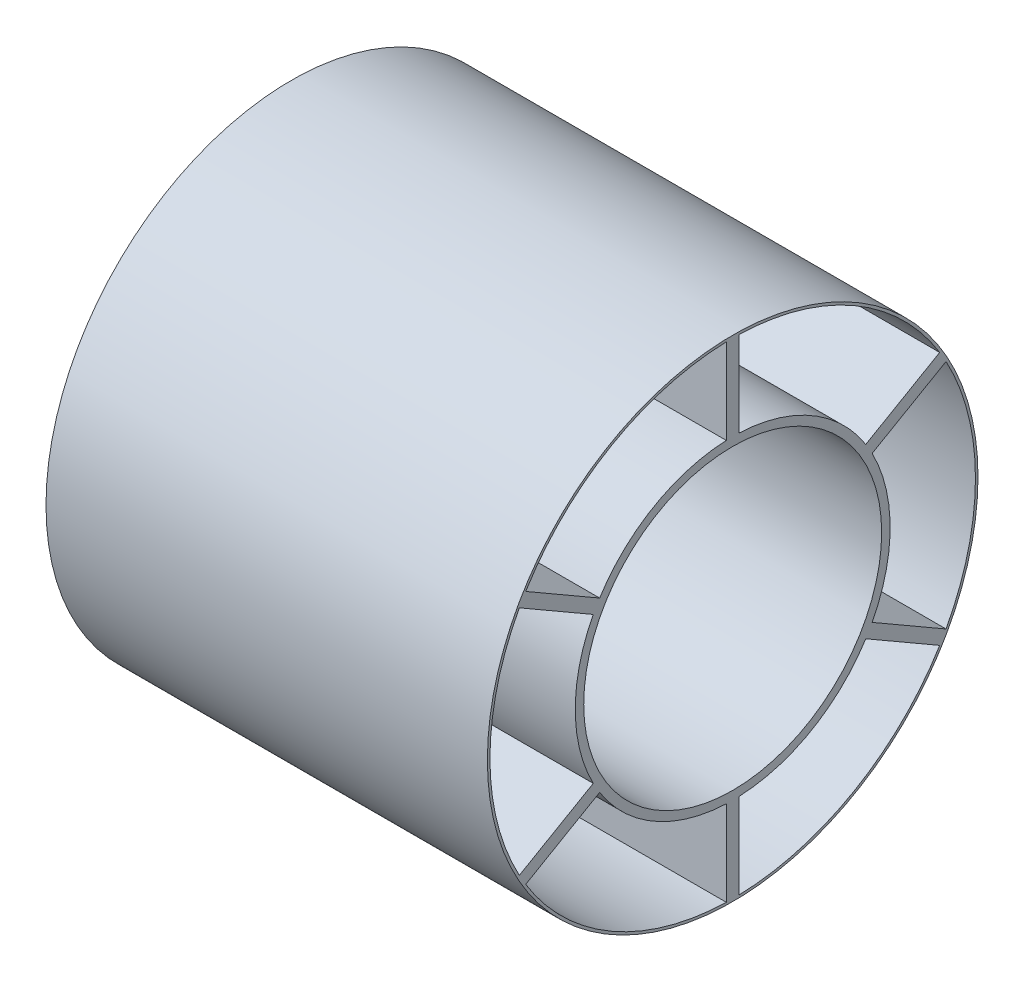
ISO-10303-21;
HEADER;
FILE_DESCRIPTION(('STEP AP214'),'2;1');
FILE_NAME('part.step','',(''),(''),'','','');
FILE_SCHEMA(('AUTOMOTIVE_DESIGN { 1 0 10303 214 1 1 1 1 }'));
ENDSEC;
DATA;
#1=APPLICATION_CONTEXT('core data for automotive mechanical design processes');
#2=APPLICATION_PROTOCOL_DEFINITION('international standard','automotive_design',2000,#1);
#3=PRODUCT_CONTEXT('',#1,'mechanical');
#4=PRODUCT('Part','Part','',(#3));
#5=PRODUCT_RELATED_PRODUCT_CATEGORY('part','',(#4));
#6=PRODUCT_DEFINITION_FORMATION('','',#4);
#7=PRODUCT_DEFINITION_CONTEXT('part definition',#1,'design');
#8=PRODUCT_DEFINITION('design','',#6,#7);
#9=PRODUCT_DEFINITION_SHAPE('','',#8);
#10=(LENGTH_UNIT() NAMED_UNIT(*) SI_UNIT(.MILLI.,.METRE.));
#11=(NAMED_UNIT(*) PLANE_ANGLE_UNIT() SI_UNIT($,.RADIAN.));
#12=(NAMED_UNIT(*) SI_UNIT($,.STERADIAN.) SOLID_ANGLE_UNIT());
#13=UNCERTAINTY_MEASURE_WITH_UNIT(LENGTH_MEASURE(1.E-05),#10,'distance_accuracy_value','');
#14=(GEOMETRIC_REPRESENTATION_CONTEXT(3) GLOBAL_UNCERTAINTY_ASSIGNED_CONTEXT((#13)) GLOBAL_UNIT_ASSIGNED_CONTEXT((#10,
#11,#12)) REPRESENTATION_CONTEXT('',''));
#15=CARTESIAN_POINT('',(0.,0.,0.));
#16=DIRECTION('',(0.,0.,1.));
#17=DIRECTION('',(1.,0.,0.));
#18=AXIS2_PLACEMENT_3D('',#15,#16,#17);
#19=CARTESIAN_POINT('',(52.,0.,0.));
#20=DIRECTION('',(1.,0.,0.));
#21=DIRECTION('',(0.,0.,-1.));
#22=AXIS2_PLACEMENT_3D('',#19,#20,#21);
#23=PLANE('',#22);
#24=CARTESIAN_POINT('',(52.,0.,0.));
#25=DIRECTION('',(1.,0.,0.));
#26=DIRECTION('',(0.,0.,-1.));
#27=AXIS2_PLACEMENT_3D('',#24,#25,#26);
#28=CIRCLE('',#27,28.6);
#29=CARTESIAN_POINT('',(52.,13.6455631434975,25.1348086624271));
#30=VERTEX_POINT('',#29);
#31=CARTESIAN_POINT('',(52.,-13.6455631434992,25.1348086624262));
#32=VERTEX_POINT('',#31);
#33=EDGE_CURVE('E415',#30,#32,#28,.T.);
#34=ORIENTED_EDGE('',*,*,#33,.F.);
#35=DIRECTION('',(0.,0.499999999999999,0.866025403784439));
#36=VECTOR('',#35,1.);
#37=CARTESIAN_POINT('',(52.,8.61789698400815,16.4266354306968));
#38=LINE('',#37,#36);
#39=CARTESIAN_POINT('',(52.,8.61789698400815,16.4266354306968));
#40=VERTEX_POINT('',#39);
#41=EDGE_CURVE('E218',#40,#30,#38,.T.);
#42=ORIENTED_EDGE('',*,*,#41,.F.);
#43=CARTESIAN_POINT('',(52.,0.,0.));
#44=DIRECTION('',(1.,0.,0.));
#45=DIRECTION('',(0.,0.,-1.));
#46=AXIS2_PLACEMENT_3D('',#43,#44,#45);
#47=CIRCLE('',#46,18.55);
#48=CARTESIAN_POINT('',(52.,-8.61789698400827,16.4266354306967));
#49=VERTEX_POINT('',#48);
#50=EDGE_CURVE('E242',#49,#40,#47,.F.);
#51=ORIENTED_EDGE('',*,*,#50,.F.);
#52=DIRECTION('',(0.,0.500000000000152,-0.866025403784351));
#53=VECTOR('',#52,1.);
#54=CARTESIAN_POINT('',(52.,-8.61789698400827,16.4266354306967));
#55=LINE('',#54,#53);
#56=EDGE_CURVE('E246',#32,#49,#55,.T.);
#57=ORIENTED_EDGE('',*,*,#56,.F.);
#58=EDGE_LOOP('',(#34,#42,#51,#57));
#59=FACE_BOUND('',#58,.T.);
#60=CARTESIAN_POINT('',(52.,-14.9446012491744,24.384808662427));
#61=VERTEX_POINT('',#60);
#62=CARTESIAN_POINT('',(52.,-28.5901643926718,0.7499999999998));
#63=VERTEX_POINT('',#62);
#64=EDGE_CURVE('E416',#61,#63,#28,.T.);
#65=ORIENTED_EDGE('',*,*,#64,.F.);
#66=DIRECTION('',(0.,-0.500000000000004,0.866025403784436));
#67=VECTOR('',#66,1.);
#68=CARTESIAN_POINT('',(52.,-9.91693508968492,15.6766354306967));
#69=LINE('',#68,#67);
#70=CARTESIAN_POINT('',(52.,-9.91693508968493,15.6766354306967));
#71=VERTEX_POINT('',#70);
#72=EDGE_CURVE('E249',#71,#61,#69,.T.);
#73=ORIENTED_EDGE('',*,*,#72,.F.);
#74=CARTESIAN_POINT('',(52.,0.,0.));
#75=DIRECTION('',(1.,0.,0.));
#76=DIRECTION('',(0.,0.,-1.));
#77=AXIS2_PLACEMENT_3D('',#74,#75,#76);
#78=CIRCLE('',#77,18.55);
#79=CARTESIAN_POINT('',(52.,-18.534832073693,0.749999999999871));
#80=VERTEX_POINT('',#79);
#81=EDGE_CURVE('E252',#80,#71,#78,.F.);
#82=ORIENTED_EDGE('',*,*,#81,.F.);
#83=DIRECTION('',(0.,1.,0.));
#84=VECTOR('',#83,1.);
#85=CARTESIAN_POINT('',(52.,-18.534832073693,0.749999999999871));
#86=LINE('',#85,#84);
#87=EDGE_CURVE('E256',#63,#80,#86,.T.);
#88=ORIENTED_EDGE('',*,*,#87,.F.);
#89=EDGE_LOOP('',(#65,#73,#82,#88));
#90=FACE_BOUND('',#89,.T.);
#91=CARTESIAN_POINT('',(52.,-28.5901643926718,-0.750000000001604));
#92=VERTEX_POINT('',#91);
#93=CARTESIAN_POINT('',(52.,-14.944601249174,-24.3848086624272));
#94=VERTEX_POINT('',#93);
#95=EDGE_CURVE('E306',#92,#94,#28,.T.);
#96=ORIENTED_EDGE('',*,*,#95,.F.);
#97=DIRECTION('',(0.,-1.,-1.46687197130195E-13));
#98=VECTOR('',#97,1.);
#99=CARTESIAN_POINT('',(52.,-18.534832073693,-0.750000000000129));
#100=LINE('',#99,#98);
#101=CARTESIAN_POINT('',(52.,-18.534832073693,-0.750000000000139));
#102=VERTEX_POINT('',#101);
#103=EDGE_CURVE('E259',#102,#92,#100,.T.);
#104=ORIENTED_EDGE('',*,*,#103,.F.);
#105=CARTESIAN_POINT('',(52.,0.,0.));
#106=DIRECTION('',(1.,0.,0.));
#107=DIRECTION('',(0.,0.,-1.));
#108=AXIS2_PLACEMENT_3D('',#105,#106,#107);
#109=CIRCLE('',#108,18.55);
#110=CARTESIAN_POINT('',(52.,-9.9169350896847,-15.6766354306969));
#111=VERTEX_POINT('',#110);
#112=EDGE_CURVE('E262',#111,#102,#109,.F.);
#113=ORIENTED_EDGE('',*,*,#112,.F.);
#114=DIRECTION('',(0.,0.499999999999992,0.866025403784443));
#115=VECTOR('',#114,1.);
#116=CARTESIAN_POINT('',(52.,-9.9169350896847,-15.6766354306969));
#117=LINE('',#116,#115);
#118=EDGE_CURVE('E266',#94,#111,#117,.T.);
#119=ORIENTED_EDGE('',*,*,#118,.F.);
#120=EDGE_LOOP('',(#96,#104,#113,#119));
#121=FACE_BOUND('',#120,.T.);
#122=CARTESIAN_POINT('',(52.,-13.6455631434965,-25.1348086624277));
#123=VERTEX_POINT('',#122);
#124=CARTESIAN_POINT('',(52.,13.6455631434979,-25.1348086624269));
#125=VERTEX_POINT('',#124);
#126=EDGE_CURVE('E304',#123,#125,#28,.T.);
#127=ORIENTED_EDGE('',*,*,#126,.F.);
#128=DIRECTION('',(0.,-0.499999999999907,-0.866025403784492));
#129=VECTOR('',#128,1.);
#130=CARTESIAN_POINT('',(52.,-8.61789698400804,-16.4266354306969));
#131=LINE('',#130,#129);
#132=CARTESIAN_POINT('',(52.,-8.61789698400804,-16.4266354306969));
#133=VERTEX_POINT('',#132);
#134=EDGE_CURVE('E269',#133,#123,#131,.T.);
#135=ORIENTED_EDGE('',*,*,#134,.F.);
#136=CARTESIAN_POINT('',(52.,0.,0.));
#137=DIRECTION('',(1.,0.,0.));
#138=DIRECTION('',(0.,0.,-1.));
#139=AXIS2_PLACEMENT_3D('',#136,#137,#138);
#140=CIRCLE('',#139,18.55);
#141=CARTESIAN_POINT('',(52.,8.61789698400838,-16.4266354306967));
#142=VERTEX_POINT('',#141);
#143=EDGE_CURVE('E272',#142,#133,#140,.F.);
#144=ORIENTED_EDGE('',*,*,#143,.F.);
#145=DIRECTION('',(0.,-0.50000000000001,0.866025403784433));
#146=VECTOR('',#145,1.);
#147=CARTESIAN_POINT('',(52.,8.61789698400838,-16.4266354306967));
#148=LINE('',#147,#146);
#149=EDGE_CURVE('E276',#125,#142,#148,.T.);
#150=ORIENTED_EDGE('',*,*,#149,.F.);
#151=EDGE_LOOP('',(#127,#135,#144,#150));
#152=FACE_BOUND('',#151,.T.);
#153=CARTESIAN_POINT('',(52.,14.9446012491745,-24.3848086624269));
#154=VERTEX_POINT('',#153);
#155=CARTESIAN_POINT('',(52.,28.5901643926718,-0.749999999999909));
#156=VERTEX_POINT('',#155);
#157=EDGE_CURVE('E308',#154,#156,#28,.T.);
#158=ORIENTED_EDGE('',*,*,#157,.F.);
#159=DIRECTION('',(0.,0.500000000000009,-0.866025403784433));
#160=VECTOR('',#159,1.);
#161=CARTESIAN_POINT('',(52.,9.91693508968501,-15.6766354306967));
#162=LINE('',#161,#160);
#163=CARTESIAN_POINT('',(52.,9.91693508968501,-15.6766354306967));
#164=VERTEX_POINT('',#163);
#165=EDGE_CURVE('E279',#164,#154,#162,.T.);
#166=ORIENTED_EDGE('',*,*,#165,.F.);
#167=CARTESIAN_POINT('',(52.,0.,0.));
#168=DIRECTION('',(1.,0.,0.));
#169=DIRECTION('',(0.,0.,-1.));
#170=AXIS2_PLACEMENT_3D('',#167,#168,#169);
#171=CIRCLE('',#170,18.55);
#172=CARTESIAN_POINT('',(52.,18.534832073693,-0.75));
#173=VERTEX_POINT('',#172);
#174=EDGE_CURVE('E282',#173,#164,#171,.F.);
#175=ORIENTED_EDGE('',*,*,#174,.F.);
#176=DIRECTION('',(0.,-1.,0.));
#177=VECTOR('',#176,1.);
#178=CARTESIAN_POINT('',(52.,18.534832073693,-0.75));
#179=LINE('',#178,#177);
#180=EDGE_CURVE('E286',#156,#173,#179,.T.);
#181=ORIENTED_EDGE('',*,*,#180,.F.);
#182=EDGE_LOOP('',(#158,#166,#175,#181));
#183=FACE_BOUND('',#182,.T.);
#184=DIRECTION('',(0.,-0.499999999999999,-0.866025403784439));
#185=VECTOR('',#184,1.);
#186=CARTESIAN_POINT('',(52.,9.91693508968481,15.6766354306968));
#187=LINE('',#186,#185);
#188=CARTESIAN_POINT('',(52.,14.9446012491742,24.3848086624271));
#189=VERTEX_POINT('',#188);
#190=CARTESIAN_POINT('',(52.,9.91693508968481,15.6766354306968));
#191=VERTEX_POINT('',#190);
#192=EDGE_CURVE('E214',#189,#191,#187,.T.);
#193=ORIENTED_EDGE('',*,*,#192,.F.);
#194=CARTESIAN_POINT('',(52.,28.5901643926718,0.750000000000003));
#195=VERTEX_POINT('',#194);
#196=EDGE_CURVE('E349',#195,#189,#28,.T.);
#197=ORIENTED_EDGE('',*,*,#196,.F.);
#198=DIRECTION('',(0.,1.,0.));
#199=VECTOR('',#198,1.);
#200=CARTESIAN_POINT('',(52.,18.534832073693,0.750000000000032));
#201=LINE('',#200,#199);
#202=CARTESIAN_POINT('',(52.,18.534832073693,0.750000000000032));
#203=VERTEX_POINT('',#202);
#204=EDGE_CURVE('E225',#203,#195,#201,.T.);
#205=ORIENTED_EDGE('',*,*,#204,.F.);
#206=CARTESIAN_POINT('',(52.,0.,0.));
#207=DIRECTION('',(1.,0.,0.));
#208=DIRECTION('',(0.,0.,-1.));
#209=AXIS2_PLACEMENT_3D('',#206,#207,#208);
#210=CIRCLE('',#209,18.55);
#211=EDGE_CURVE('E236',#191,#203,#210,.F.);
#212=ORIENTED_EDGE('',*,*,#211,.F.);
#213=EDGE_LOOP('',(#193,#197,#205,#212));
#214=FACE_BOUND('',#213,.T.);
#215=CARTESIAN_POINT('',(52.,0.,0.));
#216=DIRECTION('',(1.,0.,0.));
#217=DIRECTION('',(0.,0.,-1.));
#218=AXIS2_PLACEMENT_3D('',#215,#216,#217);
#219=CIRCLE('',#218,17.55);
#220=CARTESIAN_POINT('',(52.,0.,-17.55));
#221=VERTEX_POINT('',#220);
#222=EDGE_CURVE('E207',#221,#221,#219,.F.);
#223=ORIENTED_EDGE('',*,*,#222,.T.);
#224=EDGE_LOOP('',(#223));
#225=FACE_BOUND('',#224,.T.);
#226=CARTESIAN_POINT('',(52.,0.,0.));
#227=DIRECTION('',(1.,0.,0.));
#228=DIRECTION('',(0.,0.,-1.));
#229=AXIS2_PLACEMENT_3D('',#226,#227,#228);
#230=CIRCLE('',#229,28.9);
#231=CARTESIAN_POINT('',(52.,0.,28.9));
#232=VERTEX_POINT('',#231);
#233=EDGE_CURVE('E311',#232,#232,#230,.T.);
#234=ORIENTED_EDGE('',*,*,#233,.T.);
#235=EDGE_LOOP('',(#234));
#236=FACE_BOUND('',#235,.T.);
#237=ADVANCED_FACE('F34',(#59,#90,#121,#152,#183,#214,#225,#236),#23,.T.);
#238=CARTESIAN_POINT('',(0.,0.,0.));
#239=DIRECTION('',(1.,0.,0.));
#240=DIRECTION('',(0.,0.,-1.));
#241=AXIS2_PLACEMENT_3D('',#238,#239,#240);
#242=PLANE('',#241);
#243=DIRECTION('',(0.,0.499999999999999,0.866025403784439));
#244=VECTOR('',#243,1.);
#245=CARTESIAN_POINT('',(0.,8.61789698400815,16.4266354306968));
#246=LINE('',#245,#244);
#247=CARTESIAN_POINT('',(0.,8.61789698400815,16.4266354306968));
#248=VERTEX_POINT('',#247);
#249=CARTESIAN_POINT('',(0.,13.6455631434975,25.1348086624271));
#250=VERTEX_POINT('',#249);
#251=EDGE_CURVE('E208',#248,#250,#246,.T.);
#252=ORIENTED_EDGE('',*,*,#251,.T.);
#253=CARTESIAN_POINT('',(0.,0.,0.));
#254=DIRECTION('',(1.,0.,0.));
#255=DIRECTION('',(0.,0.,-1.));
#256=AXIS2_PLACEMENT_3D('',#253,#254,#255);
#257=CIRCLE('',#256,28.6);
#258=CARTESIAN_POINT('',(0.,-13.6455631434992,25.1348086624262));
#259=VERTEX_POINT('',#258);
#260=EDGE_CURVE('E354',#250,#259,#257,.T.);
#261=ORIENTED_EDGE('',*,*,#260,.T.);
#262=DIRECTION('',(0.,0.500000000000152,-0.866025403784351));
#263=VECTOR('',#262,1.);
#264=CARTESIAN_POINT('',(0.,-8.61789698400827,16.4266354306967));
#265=LINE('',#264,#263);
#266=CARTESIAN_POINT('',(0.,-8.61789698400827,16.4266354306967));
#267=VERTEX_POINT('',#266);
#268=EDGE_CURVE('E438',#259,#267,#265,.T.);
#269=ORIENTED_EDGE('',*,*,#268,.T.);
#270=CARTESIAN_POINT('',(0.,0.,0.));
#271=DIRECTION('',(-1.,0.,0.));
#272=DIRECTION('',(0.,0.,1.));
#273=AXIS2_PLACEMENT_3D('',#270,#271,#272);
#274=CIRCLE('',#273,18.55);
#275=EDGE_CURVE('E440',#267,#248,#274,.T.);
#276=ORIENTED_EDGE('',*,*,#275,.T.);
#277=EDGE_LOOP('',(#252,#261,#269,#276));
#278=FACE_BOUND('',#277,.T.);
#279=DIRECTION('',(0.,-0.500000000000004,0.866025403784436));
#280=VECTOR('',#279,1.);
#281=CARTESIAN_POINT('',(0.,-9.91693508968492,15.6766354306967));
#282=LINE('',#281,#280);
#283=CARTESIAN_POINT('',(0.,-9.91693508968493,15.6766354306967));
#284=VERTEX_POINT('',#283);
#285=CARTESIAN_POINT('',(0.,-14.9446012491744,24.384808662427));
#286=VERTEX_POINT('',#285);
#287=EDGE_CURVE('E436',#284,#286,#282,.T.);
#288=ORIENTED_EDGE('',*,*,#287,.T.);
#289=CARTESIAN_POINT('',(0.,-28.5901643926718,0.7499999999998));
#290=VERTEX_POINT('',#289);
#291=EDGE_CURVE('E357',#286,#290,#257,.T.);
#292=ORIENTED_EDGE('',*,*,#291,.T.);
#293=DIRECTION('',(0.,1.,0.));
#294=VECTOR('',#293,1.);
#295=CARTESIAN_POINT('',(0.,-18.534832073693,0.749999999999871));
#296=LINE('',#295,#294);
#297=CARTESIAN_POINT('',(0.,-18.534832073693,0.749999999999871));
#298=VERTEX_POINT('',#297);
#299=EDGE_CURVE('E430',#290,#298,#296,.T.);
#300=ORIENTED_EDGE('',*,*,#299,.T.);
#301=CARTESIAN_POINT('',(0.,0.,0.));
#302=DIRECTION('',(-1.,0.,0.));
#303=DIRECTION('',(0.,0.,1.));
#304=AXIS2_PLACEMENT_3D('',#301,#302,#303);
#305=CIRCLE('',#304,18.55);
#306=EDGE_CURVE('E431',#298,#284,#305,.T.);
#307=ORIENTED_EDGE('',*,*,#306,.T.);
#308=EDGE_LOOP('',(#288,#292,#300,#307));
#309=FACE_BOUND('',#308,.T.);
#310=DIRECTION('',(0.,-1.,-1.46687197130195E-13));
#311=VECTOR('',#310,1.);
#312=CARTESIAN_POINT('',(0.,-18.534832073693,-0.750000000000129));
#313=LINE('',#312,#311);
#314=CARTESIAN_POINT('',(0.,-18.534832073693,-0.750000000000139));
#315=VERTEX_POINT('',#314);
#316=CARTESIAN_POINT('',(0.,-28.5901643926718,-0.750000000001604));
#317=VERTEX_POINT('',#316);
#318=EDGE_CURVE('E372',#315,#317,#313,.T.);
#319=ORIENTED_EDGE('',*,*,#318,.T.);
#320=CARTESIAN_POINT('',(0.,-14.944601249174,-24.3848086624272));
#321=VERTEX_POINT('',#320);
#322=EDGE_CURVE('E310',#317,#321,#257,.T.);
#323=ORIENTED_EDGE('',*,*,#322,.T.);
#324=DIRECTION('',(0.,0.499999999999992,0.866025403784443));
#325=VECTOR('',#324,1.);
#326=CARTESIAN_POINT('',(0.,-9.9169350896847,-15.6766354306969));
#327=LINE('',#326,#325);
#328=CARTESIAN_POINT('',(0.,-9.9169350896847,-15.6766354306969));
#329=VERTEX_POINT('',#328);
#330=EDGE_CURVE('E370',#321,#329,#327,.T.);
#331=ORIENTED_EDGE('',*,*,#330,.T.);
#332=CARTESIAN_POINT('',(0.,0.,0.));
#333=DIRECTION('',(-1.,0.,0.));
#334=DIRECTION('',(0.,0.,1.));
#335=AXIS2_PLACEMENT_3D('',#332,#333,#334);
#336=CIRCLE('',#335,18.55);
#337=EDGE_CURVE('E379',#329,#315,#336,.T.);
#338=ORIENTED_EDGE('',*,*,#337,.T.);
#339=EDGE_LOOP('',(#319,#323,#331,#338));
#340=FACE_BOUND('',#339,.T.);
#341=DIRECTION('',(0.,-0.499999999999907,-0.866025403784492));
#342=VECTOR('',#341,1.);
#343=CARTESIAN_POINT('',(0.,-8.61789698400804,-16.4266354306969));
#344=LINE('',#343,#342);
#345=CARTESIAN_POINT('',(0.,-8.61789698400804,-16.4266354306969));
#346=VERTEX_POINT('',#345);
#347=CARTESIAN_POINT('',(0.,-13.6455631434965,-25.1348086624277));
#348=VERTEX_POINT('',#347);
#349=EDGE_CURVE('E380',#346,#348,#344,.T.);
#350=ORIENTED_EDGE('',*,*,#349,.T.);
#351=CARTESIAN_POINT('',(0.,13.6455631434979,-25.1348086624269));
#352=VERTEX_POINT('',#351);
#353=EDGE_CURVE('E49',#348,#352,#257,.T.);
#354=ORIENTED_EDGE('',*,*,#353,.T.);
#355=DIRECTION('',(0.,-0.50000000000001,0.866025403784433));
#356=VECTOR('',#355,1.);
#357=CARTESIAN_POINT('',(0.,8.61789698400838,-16.4266354306967));
#358=LINE('',#357,#356);
#359=CARTESIAN_POINT('',(0.,8.61789698400838,-16.4266354306967));
#360=VERTEX_POINT('',#359);
#361=EDGE_CURVE('E390',#352,#360,#358,.T.);
#362=ORIENTED_EDGE('',*,*,#361,.T.);
#363=CARTESIAN_POINT('',(0.,0.,0.));
#364=DIRECTION('',(-1.,0.,0.));
#365=DIRECTION('',(0.,0.,1.));
#366=AXIS2_PLACEMENT_3D('',#363,#364,#365);
#367=CIRCLE('',#366,18.55);
#368=EDGE_CURVE('E384',#360,#346,#367,.T.);
#369=ORIENTED_EDGE('',*,*,#368,.T.);
#370=EDGE_LOOP('',(#350,#354,#362,#369));
#371=FACE_BOUND('',#370,.T.);
#372=DIRECTION('',(0.,0.500000000000009,-0.866025403784433));
#373=VECTOR('',#372,1.);
#374=CARTESIAN_POINT('',(0.,9.91693508968501,-15.6766354306967));
#375=LINE('',#374,#373);
#376=CARTESIAN_POINT('',(0.,9.91693508968501,-15.6766354306967));
#377=VERTEX_POINT('',#376);
#378=CARTESIAN_POINT('',(0.,14.9446012491745,-24.3848086624269));
#379=VERTEX_POINT('',#378);
#380=EDGE_CURVE('E392',#377,#379,#375,.T.);
#381=ORIENTED_EDGE('',*,*,#380,.T.);
#382=CARTESIAN_POINT('',(0.,28.5901643926718,-0.749999999999909));
#383=VERTEX_POINT('',#382);
#384=EDGE_CURVE('E307',#379,#383,#257,.T.);
#385=ORIENTED_EDGE('',*,*,#384,.T.);
#386=DIRECTION('',(0.,-1.,0.));
#387=VECTOR('',#386,1.);
#388=CARTESIAN_POINT('',(0.,18.534832073693,-0.75));
#389=LINE('',#388,#387);
#390=CARTESIAN_POINT('',(0.,18.534832073693,-0.75));
#391=VERTEX_POINT('',#390);
#392=EDGE_CURVE('E227',#383,#391,#389,.T.);
#393=ORIENTED_EDGE('',*,*,#392,.T.);
#394=CARTESIAN_POINT('',(0.,0.,0.));
#395=DIRECTION('',(-1.,0.,0.));
#396=DIRECTION('',(0.,0.,1.));
#397=AXIS2_PLACEMENT_3D('',#394,#395,#396);
#398=CIRCLE('',#397,18.55);
#399=EDGE_CURVE('E395',#391,#377,#398,.T.);
#400=ORIENTED_EDGE('',*,*,#399,.T.);
#401=EDGE_LOOP('',(#381,#385,#393,#400));
#402=FACE_BOUND('',#401,.T.);
#403=CARTESIAN_POINT('',(0.,28.5901643926718,0.750000000000003));
#404=VERTEX_POINT('',#403);
#405=CARTESIAN_POINT('',(0.,14.9446012491742,24.3848086624271));
#406=VERTEX_POINT('',#405);
#407=EDGE_CURVE('E204',#404,#406,#257,.T.);
#408=ORIENTED_EDGE('',*,*,#407,.T.);
#409=DIRECTION('',(0.,-0.499999999999999,-0.866025403784439));
#410=VECTOR('',#409,1.);
#411=CARTESIAN_POINT('',(0.,9.91693508968481,15.6766354306968));
#412=LINE('',#411,#410);
#413=CARTESIAN_POINT('',(0.,9.91693508968481,15.6766354306968));
#414=VERTEX_POINT('',#413);
#415=EDGE_CURVE('E197',#406,#414,#412,.T.);
#416=ORIENTED_EDGE('',*,*,#415,.T.);
#417=CARTESIAN_POINT('',(0.,0.,0.));
#418=DIRECTION('',(-1.,0.,0.));
#419=DIRECTION('',(0.,0.,1.));
#420=AXIS2_PLACEMENT_3D('',#417,#418,#419);
#421=CIRCLE('',#420,18.55);
#422=CARTESIAN_POINT('',(0.,18.534832073693,0.750000000000032));
#423=VERTEX_POINT('',#422);
#424=EDGE_CURVE('E203',#414,#423,#421,.T.);
#425=ORIENTED_EDGE('',*,*,#424,.T.);
#426=DIRECTION('',(0.,1.,0.));
#427=VECTOR('',#426,1.);
#428=CARTESIAN_POINT('',(0.,18.534832073693,0.750000000000032));
#429=LINE('',#428,#427);
#430=EDGE_CURVE('E224',#423,#404,#429,.T.);
#431=ORIENTED_EDGE('',*,*,#430,.T.);
#432=EDGE_LOOP('',(#408,#416,#425,#431));
#433=FACE_BOUND('',#432,.T.);
#434=CARTESIAN_POINT('',(0.,0.,0.));
#435=DIRECTION('',(-1.,0.,0.));
#436=DIRECTION('',(0.,0.,1.));
#437=AXIS2_PLACEMENT_3D('',#434,#435,#436);
#438=CIRCLE('',#437,15.);
#439=CARTESIAN_POINT('',(0.,0.,15.));
#440=VERTEX_POINT('',#439);
#441=EDGE_CURVE('E444',#440,#440,#438,.T.);
#442=ORIENTED_EDGE('',*,*,#441,.F.);
#443=EDGE_LOOP('',(#442));
#444=FACE_BOUND('',#443,.T.);
#445=CARTESIAN_POINT('',(0.,0.,0.));
#446=DIRECTION('',(1.,0.,0.));
#447=DIRECTION('',(0.,0.,-1.));
#448=AXIS2_PLACEMENT_3D('',#445,#446,#447);
#449=CIRCLE('',#448,28.9);
#450=CARTESIAN_POINT('',(0.,0.,28.9));
#451=VERTEX_POINT('',#450);
#452=EDGE_CURVE('E315',#451,#451,#449,.T.);
#453=ORIENTED_EDGE('',*,*,#452,.F.);
#454=EDGE_LOOP('',(#453));
#455=FACE_BOUND('',#454,.T.);
#456=ADVANCED_FACE('F199',(#278,#309,#340,#371,#402,#433,#444,#455),#242,.F.);
#457=CARTESIAN_POINT('',(131.129231415388,0.,0.));
#458=DIRECTION('',(-1.,0.,0.));
#459=DIRECTION('',(0.,0.,1.));
#460=AXIS2_PLACEMENT_3D('',#457,#458,#459);
#461=CYLINDRICAL_SURFACE('',#460,17.55);
#462=ORIENTED_EDGE('',*,*,#222,.F.);
#463=EDGE_LOOP('',(#462));
#464=FACE_BOUND('',#463,.T.);
#465=CARTESIAN_POINT('',(2.,0.,0.));
#466=DIRECTION('',(-1.,0.,0.));
#467=DIRECTION('',(0.,0.,1.));
#468=AXIS2_PLACEMENT_3D('',#465,#466,#467);
#469=CIRCLE('',#468,17.55);
#470=CARTESIAN_POINT('',(2.,0.,17.55));
#471=VERTEX_POINT('',#470);
#472=EDGE_CURVE('E12',#471,#471,#469,.F.);
#473=ORIENTED_EDGE('',*,*,#472,.F.);
#474=EDGE_LOOP('',(#473));
#475=FACE_BOUND('',#474,.T.);
#476=ADVANCED_FACE('F460',(#464,#475),#461,.F.);
#477=CARTESIAN_POINT('',(52.,0.,0.));
#478=DIRECTION('',(-1.,0.,0.));
#479=DIRECTION('',(0.,0.,1.));
#480=AXIS2_PLACEMENT_3D('',#477,#478,#479);
#481=CYLINDRICAL_SURFACE('',#480,28.6);
#482=DIRECTION('',(-1.,0.,0.));
#483=VECTOR('',#482,1.);
#484=CARTESIAN_POINT('',(52.,14.9446012491742,24.3848086624271));
#485=LINE('',#484,#483);
#486=EDGE_CURVE('E42',#406,#189,#485,.F.);
#487=ORIENTED_EDGE('',*,*,#486,.F.);
#488=ORIENTED_EDGE('',*,*,#407,.F.);
#489=DIRECTION('',(-1.,0.,0.));
#490=VECTOR('',#489,1.);
#491=CARTESIAN_POINT('',(52.,28.5901643926718,0.750000000000003));
#492=LINE('',#491,#490);
#493=EDGE_CURVE('E314',#195,#404,#492,.T.);
#494=ORIENTED_EDGE('',*,*,#493,.F.);
#495=ORIENTED_EDGE('',*,*,#196,.T.);
#496=EDGE_LOOP('',(#487,#488,#494,#495));
#497=FACE_BOUND('',#496,.T.);
#498=ADVANCED_FACE('F353',(#497),#481,.F.);
#499=DIRECTION('',(-1.,0.,0.));
#500=VECTOR('',#499,1.);
#501=CARTESIAN_POINT('',(52.,13.6455631434975,25.1348086624271));
#502=LINE('',#501,#500);
#503=EDGE_CURVE('E344',#30,#250,#502,.T.);
#504=ORIENTED_EDGE('',*,*,#503,.F.);
#505=ORIENTED_EDGE('',*,*,#33,.T.);
#506=DIRECTION('',(-1.,0.,0.));
#507=VECTOR('',#506,1.);
#508=CARTESIAN_POINT('',(52.,-13.6455631434992,25.1348086624262));
#509=LINE('',#508,#507);
#510=EDGE_CURVE('E341',#259,#32,#509,.F.);
#511=ORIENTED_EDGE('',*,*,#510,.F.);
#512=ORIENTED_EDGE('',*,*,#260,.F.);
#513=EDGE_LOOP('',(#504,#505,#511,#512));
#514=FACE_BOUND('',#513,.T.);
#515=ADVANCED_FACE('F659',(#514),#481,.F.);
#516=DIRECTION('',(-1.,0.,0.));
#517=VECTOR('',#516,1.);
#518=CARTESIAN_POINT('',(52.,-14.9446012491744,24.384808662427));
#519=LINE('',#518,#517);
#520=EDGE_CURVE('E338',#61,#286,#519,.T.);
#521=ORIENTED_EDGE('',*,*,#520,.F.);
#522=ORIENTED_EDGE('',*,*,#64,.T.);
#523=DIRECTION('',(-1.,0.,0.));
#524=VECTOR('',#523,1.);
#525=CARTESIAN_POINT('',(52.,-28.5901643926718,0.7499999999998));
#526=LINE('',#525,#524);
#527=EDGE_CURVE('E335',#290,#63,#526,.F.);
#528=ORIENTED_EDGE('',*,*,#527,.F.);
#529=ORIENTED_EDGE('',*,*,#291,.F.);
#530=EDGE_LOOP('',(#521,#522,#528,#529));
#531=FACE_BOUND('',#530,.T.);
#532=ADVANCED_FACE('F665',(#531),#481,.F.);
#533=DIRECTION('',(-1.,0.,0.));
#534=VECTOR('',#533,1.);
#535=CARTESIAN_POINT('',(52.,-28.5901643926718,-0.750000000001604));
#536=LINE('',#535,#534);
#537=EDGE_CURVE('E332',#92,#317,#536,.T.);
#538=ORIENTED_EDGE('',*,*,#537,.F.);
#539=ORIENTED_EDGE('',*,*,#95,.T.);
#540=DIRECTION('',(-1.,0.,0.));
#541=VECTOR('',#540,1.);
#542=CARTESIAN_POINT('',(52.,-14.944601249174,-24.3848086624272));
#543=LINE('',#542,#541);
#544=EDGE_CURVE('E57',#321,#94,#543,.F.);
#545=ORIENTED_EDGE('',*,*,#544,.F.);
#546=ORIENTED_EDGE('',*,*,#322,.F.);
#547=EDGE_LOOP('',(#538,#539,#545,#546));
#548=FACE_BOUND('',#547,.T.);
#549=ADVANCED_FACE('F421',(#548),#481,.F.);
#550=DIRECTION('',(-1.,0.,0.));
#551=VECTOR('',#550,1.);
#552=CARTESIAN_POINT('',(52.,-13.6455631434965,-25.1348086624277));
#553=LINE('',#552,#551);
#554=EDGE_CURVE('E329',#123,#348,#553,.T.);
#555=ORIENTED_EDGE('',*,*,#554,.F.);
#556=ORIENTED_EDGE('',*,*,#126,.T.);
#557=DIRECTION('',(-1.,0.,0.));
#558=VECTOR('',#557,1.);
#559=CARTESIAN_POINT('',(52.,13.6455631434979,-25.1348086624269));
#560=LINE('',#559,#558);
#561=EDGE_CURVE('E326',#352,#125,#560,.F.);
#562=ORIENTED_EDGE('',*,*,#561,.F.);
#563=ORIENTED_EDGE('',*,*,#353,.F.);
#564=EDGE_LOOP('',(#555,#556,#562,#563));
#565=FACE_BOUND('',#564,.T.);
#566=ADVANCED_FACE('F465',(#565),#481,.F.);
#567=CARTESIAN_POINT('',(52.,0.,0.));
#568=DIRECTION('',(-1.,0.,0.));
#569=DIRECTION('',(0.,0.,1.));
#570=AXIS2_PLACEMENT_3D('',#567,#568,#569);
#571=CYLINDRICAL_SURFACE('',#570,28.9);
#572=CARTESIAN_POINT('',(0.,0.,28.9));
#573=CARTESIAN_POINT('',(0.541666666666667,0.,28.9));
#574=CARTESIAN_POINT('',(1.08333333333333,0.,28.9));
#575=CARTESIAN_POINT('',(2.16666666666667,0.,28.9));
#576=CARTESIAN_POINT('',(2.70833333333334,0.,28.9));
#577=CARTESIAN_POINT('',(3.79166666666667,0.,28.9));
#578=CARTESIAN_POINT('',(4.33333333333333,0.,28.9));
#579=CARTESIAN_POINT('',(5.41666666666666,0.,28.9));
#580=CARTESIAN_POINT('',(5.95833333333333,0.,28.9));
#581=CARTESIAN_POINT('',(7.04166666666667,0.,28.9));
#582=CARTESIAN_POINT('',(7.58333333333333,0.,28.9));
#583=CARTESIAN_POINT('',(8.66666666666667,0.,28.9));
#584=CARTESIAN_POINT('',(9.20833333333333,0.,28.9));
#585=CARTESIAN_POINT('',(10.2916666666667,0.,28.9));
#586=CARTESIAN_POINT('',(10.8333333333333,0.,28.9));
#587=CARTESIAN_POINT('',(11.9166666666667,0.,28.9));
#588=CARTESIAN_POINT('',(12.4583333333333,0.,28.9));
#589=CARTESIAN_POINT('',(13.5416666666667,0.,28.9));
#590=CARTESIAN_POINT('',(14.0833333333333,0.,28.9));
#591=CARTESIAN_POINT('',(15.1666666666667,0.,28.9));
#592=CARTESIAN_POINT('',(15.7083333333333,0.,28.9));
#593=CARTESIAN_POINT('',(16.7916666666667,0.,28.9));
#594=CARTESIAN_POINT('',(17.3333333333333,0.,28.9));
#595=CARTESIAN_POINT('',(18.4166666666667,0.,28.9));
#596=CARTESIAN_POINT('',(18.9583333333333,0.,28.9));
#597=CARTESIAN_POINT('',(20.0416666666667,0.,28.9));
#598=CARTESIAN_POINT('',(20.5833333333333,0.,28.9));
#599=CARTESIAN_POINT('',(21.6666666666667,0.,28.9));
#600=CARTESIAN_POINT('',(22.2083333333333,0.,28.9));
#601=CARTESIAN_POINT('',(23.2916666666667,0.,28.9));
#602=CARTESIAN_POINT('',(23.8333333333333,0.,28.9));
#603=CARTESIAN_POINT('',(24.9166666666667,0.,28.9));
#604=CARTESIAN_POINT('',(25.4583333333333,0.,28.9));
#605=CARTESIAN_POINT('',(26.5416666666667,0.,28.9));
#606=CARTESIAN_POINT('',(27.0833333333333,0.,28.9));
#607=CARTESIAN_POINT('',(28.1666666666667,0.,28.9));
#608=CARTESIAN_POINT('',(28.7083333333333,0.,28.9));
#609=CARTESIAN_POINT('',(29.7916666666667,0.,28.9));
#610=CARTESIAN_POINT('',(30.3333333333333,0.,28.9));
#611=CARTESIAN_POINT('',(31.4166666666667,0.,28.9));
#612=CARTESIAN_POINT('',(31.9583333333333,0.,28.9));
#613=CARTESIAN_POINT('',(33.0416666666667,0.,28.9));
#614=CARTESIAN_POINT('',(33.5833333333333,0.,28.9));
#615=CARTESIAN_POINT('',(34.6666666666667,0.,28.9));
#616=CARTESIAN_POINT('',(35.2083333333333,0.,28.9));
#617=CARTESIAN_POINT('',(36.2916666666667,0.,28.9));
#618=CARTESIAN_POINT('',(36.8333333333333,0.,28.9));
#619=CARTESIAN_POINT('',(37.9166666666667,0.,28.9));
#620=CARTESIAN_POINT('',(38.4583333333333,0.,28.9));
#621=CARTESIAN_POINT('',(39.5416666666667,0.,28.9));
#622=CARTESIAN_POINT('',(40.0833333333333,0.,28.9));
#623=CARTESIAN_POINT('',(41.1666666666667,0.,28.9));
#624=CARTESIAN_POINT('',(41.7083333333333,0.,28.9));
#625=CARTESIAN_POINT('',(42.7916666666667,0.,28.9));
#626=CARTESIAN_POINT('',(43.3333333333333,0.,28.9));
#627=CARTESIAN_POINT('',(44.4166666666667,0.,28.9));
#628=CARTESIAN_POINT('',(44.9583333333333,0.,28.9));
#629=CARTESIAN_POINT('',(46.0416666666667,0.,28.9));
#630=CARTESIAN_POINT('',(46.5833333333333,0.,28.9));
#631=CARTESIAN_POINT('',(47.6666666666667,0.,28.9));
#632=CARTESIAN_POINT('',(48.2083333333333,0.,28.9));
#633=CARTESIAN_POINT('',(49.2916666666667,0.,28.9));
#634=CARTESIAN_POINT('',(49.8333333333333,0.,28.9));
#635=CARTESIAN_POINT('',(50.9166666666667,0.,28.9));
#636=CARTESIAN_POINT('',(51.4583333333333,0.,28.9));
#637=CARTESIAN_POINT('',(52.,0.,28.9));
#638=B_SPLINE_CURVE_WITH_KNOTS('',3,(#572,#573,#574,#575,#576,#577,#578,#579,#580,#581,#582,
#583,#584,#585,#586,#587,#588,#589,#590,#591,#592,#593,#594,#595,#596,#597,#598,#599,#600,#601,
#602,#603,#604,#605,#606,#607,#608,#609,#610,#611,#612,#613,#614,#615,#616,#617,#618,#619,#620,
#621,#622,#623,#624,#625,#626,#627,#628,#629,#630,#631,#632,#633,#634,#635,#636,#637),
.UNSPECIFIED.,.F.,.F.,(4,2,2,2,2,2,2,2,2,2,2,2,2,2,2,2,2,2,2,2,2,2,2,2,2,2,2,2,2,2,2,2,4),(0.,
1.625,3.25,4.875,6.5,8.125,9.75,11.375,13.,14.625,16.25,17.875,19.5,21.125,22.75,24.375,26.,
27.625,29.25,30.875,32.5,34.125,35.75,37.375,39.,40.625,42.25,43.875,45.5,47.125,48.75,50.375,
52.),.UNSPECIFIED.);
#639=EDGE_CURVE('BSEAM36',#451,#232,#638,.T.);
#640=ORIENTED_EDGE('',*,*,#452,.T.);
#641=ORIENTED_EDGE('',*,*,#233,.F.);
#642=ORIENTED_EDGE('',*,*,#639,.T.);
#643=ORIENTED_EDGE('',*,*,#639,.F.);
#644=EDGE_LOOP('',(#640,#642,#641,#643));
#645=FACE_BOUND('',#644,.T.);
#646=ADVANCED_FACE('F36',(#645),#571,.T.);
#647=DIRECTION('',(-1.,0.,0.));
#648=VECTOR('',#647,1.);
#649=CARTESIAN_POINT('',(52.,14.9446012491745,-24.3848086624269));
#650=LINE('',#649,#648);
#651=EDGE_CURVE('E323',#154,#379,#650,.T.);
#652=ORIENTED_EDGE('',*,*,#651,.F.);
#653=ORIENTED_EDGE('',*,*,#157,.T.);
#654=DIRECTION('',(-1.,0.,0.));
#655=VECTOR('',#654,1.);
#656=CARTESIAN_POINT('',(52.,28.5901643926718,-0.749999999999909));
#657=LINE('',#656,#655);
#658=EDGE_CURVE('E320',#383,#156,#657,.F.);
#659=ORIENTED_EDGE('',*,*,#658,.F.);
#660=ORIENTED_EDGE('',*,*,#384,.F.);
#661=EDGE_LOOP('',(#652,#653,#659,#660));
#662=FACE_BOUND('',#661,.T.);
#663=ADVANCED_FACE('F413',(#662),#481,.F.);
#664=CARTESIAN_POINT('',(131.129231415388,0.,0.));
#665=DIRECTION('',(-1.,0.,0.));
#666=DIRECTION('',(0.,0.,1.));
#667=AXIS2_PLACEMENT_3D('',#664,#665,#666);
#668=CYLINDRICAL_SURFACE('',#667,18.55);
#669=DIRECTION('',(-1.,0.,0.));
#670=VECTOR('',#669,1.);
#671=CARTESIAN_POINT('',(131.129231415388,8.61789698400838,-16.4266354306967));
#672=LINE('',#671,#670);
#673=EDGE_CURVE('E278',#142,#360,#672,.T.);
#674=ORIENTED_EDGE('',*,*,#673,.F.);
#675=ORIENTED_EDGE('',*,*,#143,.T.);
#676=DIRECTION('',(-1.,0.,0.));
#677=VECTOR('',#676,1.);
#678=CARTESIAN_POINT('',(131.129231415388,-8.61789698400804,-16.4266354306969));
#679=LINE('',#678,#677);
#680=EDGE_CURVE('E275',#133,#346,#679,.T.);
#681=ORIENTED_EDGE('',*,*,#680,.T.);
#682=ORIENTED_EDGE('',*,*,#368,.F.);
#683=EDGE_LOOP('',(#674,#675,#681,#682));
#684=FACE_BOUND('',#683,.T.);
#685=ADVANCED_FACE('F477',(#684),#668,.T.);
#686=CARTESIAN_POINT('',(131.129231415388,0.,0.));
#687=DIRECTION('',(-1.,0.,0.));
#688=DIRECTION('',(0.,0.,1.));
#689=AXIS2_PLACEMENT_3D('',#686,#687,#688);
#690=CYLINDRICAL_SURFACE('',#689,18.55);
#691=DIRECTION('',(-1.,0.,0.));
#692=VECTOR('',#691,1.);
#693=CARTESIAN_POINT('',(131.129231415388,-9.9169350896847,-15.6766354306969));
#694=LINE('',#693,#692);
#695=EDGE_CURVE('E268',#111,#329,#694,.T.);
#696=ORIENTED_EDGE('',*,*,#695,.F.);
#697=ORIENTED_EDGE('',*,*,#112,.T.);
#698=DIRECTION('',(-1.,0.,0.));
#699=VECTOR('',#698,1.);
#700=CARTESIAN_POINT('',(131.129231415388,-18.534832073693,-0.750000000000139));
#701=LINE('',#700,#699);
#702=EDGE_CURVE('E265',#102,#315,#701,.T.);
#703=ORIENTED_EDGE('',*,*,#702,.T.);
#704=ORIENTED_EDGE('',*,*,#337,.F.);
#705=EDGE_LOOP('',(#696,#697,#703,#704));
#706=FACE_BOUND('',#705,.T.);
#707=ADVANCED_FACE('F427',(#706),#690,.T.);
#708=CARTESIAN_POINT('',(131.129231415388,0.,0.));
#709=DIRECTION('',(-1.,0.,0.));
#710=DIRECTION('',(0.,0.,1.));
#711=AXIS2_PLACEMENT_3D('',#708,#709,#710);
#712=CYLINDRICAL_SURFACE('',#711,18.55);
#713=DIRECTION('',(-1.,0.,0.));
#714=VECTOR('',#713,1.);
#715=CARTESIAN_POINT('',(131.129231415388,-18.534832073693,0.749999999999871));
#716=LINE('',#715,#714);
#717=EDGE_CURVE('E258',#80,#298,#716,.T.);
#718=ORIENTED_EDGE('',*,*,#717,.F.);
#719=ORIENTED_EDGE('',*,*,#81,.T.);
#720=DIRECTION('',(-1.,0.,0.));
#721=VECTOR('',#720,1.);
#722=CARTESIAN_POINT('',(131.129231415388,-9.91693508968493,15.6766354306967));
#723=LINE('',#722,#721);
#724=EDGE_CURVE('E255',#71,#284,#723,.T.);
#725=ORIENTED_EDGE('',*,*,#724,.T.);
#726=ORIENTED_EDGE('',*,*,#306,.F.);
#727=EDGE_LOOP('',(#718,#719,#725,#726));
#728=FACE_BOUND('',#727,.T.);
#729=ADVANCED_FACE('F493',(#728),#712,.T.);
#730=CARTESIAN_POINT('',(131.129231415388,0.,0.));
#731=DIRECTION('',(-1.,0.,0.));
#732=DIRECTION('',(0.,0.,1.));
#733=AXIS2_PLACEMENT_3D('',#730,#731,#732);
#734=CYLINDRICAL_SURFACE('',#733,18.55);
#735=DIRECTION('',(-1.,0.,0.));
#736=VECTOR('',#735,1.);
#737=CARTESIAN_POINT('',(131.129231415388,-8.61789698400827,16.4266354306967));
#738=LINE('',#737,#736);
#739=EDGE_CURVE('E248',#49,#267,#738,.T.);
#740=ORIENTED_EDGE('',*,*,#739,.F.);
#741=ORIENTED_EDGE('',*,*,#50,.T.);
#742=DIRECTION('',(-1.,0.,0.));
#743=VECTOR('',#742,1.);
#744=CARTESIAN_POINT('',(131.129231415388,8.61789698400815,16.4266354306968));
#745=LINE('',#744,#743);
#746=EDGE_CURVE('E245',#40,#248,#745,.T.);
#747=ORIENTED_EDGE('',*,*,#746,.T.);
#748=ORIENTED_EDGE('',*,*,#275,.F.);
#749=EDGE_LOOP('',(#740,#741,#747,#748));
#750=FACE_BOUND('',#749,.T.);
#751=ADVANCED_FACE('F483',(#750),#734,.T.);
#752=CARTESIAN_POINT('',(131.129231415388,0.,0.));
#753=DIRECTION('',(-1.,0.,0.));
#754=DIRECTION('',(0.,0.,1.));
#755=AXIS2_PLACEMENT_3D('',#752,#753,#754);
#756=CYLINDRICAL_SURFACE('',#755,18.55);
#757=DIRECTION('',(-1.,0.,0.));
#758=VECTOR('',#757,1.);
#759=CARTESIAN_POINT('',(131.129231415388,9.91693508968481,15.6766354306968));
#760=LINE('',#759,#758);
#761=EDGE_CURVE('E211',#191,#414,#760,.T.);
#762=ORIENTED_EDGE('',*,*,#761,.F.);
#763=ORIENTED_EDGE('',*,*,#211,.T.);
#764=DIRECTION('',(-1.,0.,0.));
#765=VECTOR('',#764,1.);
#766=CARTESIAN_POINT('',(131.129231415388,18.534832073693,0.750000000000032));
#767=LINE('',#766,#765);
#768=EDGE_CURVE('E222',#203,#423,#767,.T.);
#769=ORIENTED_EDGE('',*,*,#768,.T.);
#770=ORIENTED_EDGE('',*,*,#424,.F.);
#771=EDGE_LOOP('',(#762,#763,#769,#770));
#772=FACE_BOUND('',#771,.T.);
#773=ADVANCED_FACE('F220',(#772),#756,.T.);
#774=CARTESIAN_POINT('',(131.129231415388,0.,0.));
#775=DIRECTION('',(-1.,0.,0.));
#776=DIRECTION('',(0.,0.,1.));
#777=AXIS2_PLACEMENT_3D('',#774,#775,#776);
#778=CYLINDRICAL_SURFACE('',#777,18.55);
#779=DIRECTION('',(-1.,0.,0.));
#780=VECTOR('',#779,1.);
#781=CARTESIAN_POINT('',(131.129231415388,18.534832073693,-0.75));
#782=LINE('',#781,#780);
#783=EDGE_CURVE('E230',#173,#391,#782,.T.);
#784=ORIENTED_EDGE('',*,*,#783,.F.);
#785=ORIENTED_EDGE('',*,*,#174,.T.);
#786=DIRECTION('',(-1.,0.,0.));
#787=VECTOR('',#786,1.);
#788=CARTESIAN_POINT('',(131.129231415388,9.91693508968501,-15.6766354306967));
#789=LINE('',#788,#787);
#790=EDGE_CURVE('E285',#164,#377,#789,.T.);
#791=ORIENTED_EDGE('',*,*,#790,.T.);
#792=ORIENTED_EDGE('',*,*,#399,.F.);
#793=EDGE_LOOP('',(#784,#785,#791,#792));
#794=FACE_BOUND('',#793,.T.);
#795=ADVANCED_FACE('F406',(#794),#778,.T.);
#796=CARTESIAN_POINT('',(131.129231415388,18.534832073693,0.750000000000032));
#797=DIRECTION('',(0.,0.,1.));
#798=DIRECTION('',(0.,-1.,0.));
#799=AXIS2_PLACEMENT_3D('',#796,#797,#798);
#800=PLANE('',#799);
#801=ORIENTED_EDGE('',*,*,#204,.T.);
#802=ORIENTED_EDGE('',*,*,#493,.T.);
#803=ORIENTED_EDGE('',*,*,#430,.F.);
#804=ORIENTED_EDGE('',*,*,#768,.F.);
#805=EDGE_LOOP('',(#801,#802,#803,#804));
#806=FACE_BOUND('',#805,.T.);
#807=ADVANCED_FACE('F352',(#806),#800,.T.);
#808=CARTESIAN_POINT('',(131.129231415388,18.534832073693,-0.75));
#809=DIRECTION('',(0.,0.,-1.));
#810=DIRECTION('',(0.,1.,0.));
#811=AXIS2_PLACEMENT_3D('',#808,#809,#810);
#812=PLANE('',#811);
#813=ORIENTED_EDGE('',*,*,#392,.F.);
#814=ORIENTED_EDGE('',*,*,#658,.T.);
#815=ORIENTED_EDGE('',*,*,#180,.T.);
#816=ORIENTED_EDGE('',*,*,#783,.T.);
#817=EDGE_LOOP('',(#813,#814,#815,#816));
#818=FACE_BOUND('',#817,.T.);
#819=ADVANCED_FACE('F402',(#818),#812,.T.);
#820=CARTESIAN_POINT('',(131.129231415388,9.91693508968501,-15.6766354306967));
#821=DIRECTION('',(0.,0.866025403784433,0.500000000000009));
#822=DIRECTION('',(0.,-0.500000000000009,0.866025403784433));
#823=AXIS2_PLACEMENT_3D('',#820,#821,#822);
#824=PLANE('',#823);
#825=ORIENTED_EDGE('',*,*,#165,.T.);
#826=ORIENTED_EDGE('',*,*,#651,.T.);
#827=ORIENTED_EDGE('',*,*,#380,.F.);
#828=ORIENTED_EDGE('',*,*,#790,.F.);
#829=EDGE_LOOP('',(#825,#826,#827,#828));
#830=FACE_BOUND('',#829,.T.);
#831=ADVANCED_FACE('F410',(#830),#824,.T.);
#832=CARTESIAN_POINT('',(131.129231415388,8.61789698400838,-16.4266354306967));
#833=DIRECTION('',(0.,-0.866025403784433,-0.50000000000001));
#834=DIRECTION('',(0.,0.50000000000001,-0.866025403784433));
#835=AXIS2_PLACEMENT_3D('',#832,#833,#834);
#836=PLANE('',#835);
#837=ORIENTED_EDGE('',*,*,#361,.F.);
#838=ORIENTED_EDGE('',*,*,#561,.T.);
#839=ORIENTED_EDGE('',*,*,#149,.T.);
#840=ORIENTED_EDGE('',*,*,#673,.T.);
#841=EDGE_LOOP('',(#837,#838,#839,#840));
#842=FACE_BOUND('',#841,.T.);
#843=ADVANCED_FACE('F518',(#842),#836,.T.);
#844=CARTESIAN_POINT('',(131.129231415388,-8.61789698400804,-16.4266354306969));
#845=DIRECTION('',(0.,0.866025403784492,-0.499999999999907));
#846=DIRECTION('',(0.,0.499999999999907,0.866025403784492));
#847=AXIS2_PLACEMENT_3D('',#844,#845,#846);
#848=PLANE('',#847);
#849=ORIENTED_EDGE('',*,*,#134,.T.);
#850=ORIENTED_EDGE('',*,*,#554,.T.);
#851=ORIENTED_EDGE('',*,*,#349,.F.);
#852=ORIENTED_EDGE('',*,*,#680,.F.);
#853=EDGE_LOOP('',(#849,#850,#851,#852));
#854=FACE_BOUND('',#853,.T.);
#855=ADVANCED_FACE('F515',(#854),#848,.T.);
#856=CARTESIAN_POINT('',(131.129231415388,-9.9169350896847,-15.6766354306969));
#857=DIRECTION('',(0.,-0.866025403784443,0.499999999999992));
#858=DIRECTION('',(0.,-0.499999999999992,-0.866025403784443));
#859=AXIS2_PLACEMENT_3D('',#856,#857,#858);
#860=PLANE('',#859);
#861=ORIENTED_EDGE('',*,*,#330,.F.);
#862=ORIENTED_EDGE('',*,*,#544,.T.);
#863=ORIENTED_EDGE('',*,*,#118,.T.);
#864=ORIENTED_EDGE('',*,*,#695,.T.);
#865=EDGE_LOOP('',(#861,#862,#863,#864));
#866=FACE_BOUND('',#865,.T.);
#867=ADVANCED_FACE('F375',(#866),#860,.T.);
#868=CARTESIAN_POINT('',(131.129231415388,-18.534832073693,-0.750000000000129));
#869=DIRECTION('',(0.,1.46687197130195E-13,-1.));
#870=DIRECTION('',(0.,1.,1.46687197130195E-13));
#871=AXIS2_PLACEMENT_3D('',#868,#869,#870);
#872=PLANE('',#871);
#873=ORIENTED_EDGE('',*,*,#103,.T.);
#874=ORIENTED_EDGE('',*,*,#537,.T.);
#875=ORIENTED_EDGE('',*,*,#318,.F.);
#876=ORIENTED_EDGE('',*,*,#702,.F.);
#877=EDGE_LOOP('',(#873,#874,#875,#876));
#878=FACE_BOUND('',#877,.T.);
#879=ADVANCED_FACE('F429',(#878),#872,.T.);
#880=CARTESIAN_POINT('',(131.129231415388,-18.534832073693,0.749999999999871));
#881=DIRECTION('',(0.,0.,1.));
#882=DIRECTION('',(0.,-1.,0.));
#883=AXIS2_PLACEMENT_3D('',#880,#881,#882);
#884=PLANE('',#883);
#885=ORIENTED_EDGE('',*,*,#299,.F.);
#886=ORIENTED_EDGE('',*,*,#527,.T.);
#887=ORIENTED_EDGE('',*,*,#87,.T.);
#888=ORIENTED_EDGE('',*,*,#717,.T.);
#889=EDGE_LOOP('',(#885,#886,#887,#888));
#890=FACE_BOUND('',#889,.T.);
#891=ADVANCED_FACE('F501',(#890),#884,.T.);
#892=CARTESIAN_POINT('',(131.129231415388,-9.91693508968492,15.6766354306967));
#893=DIRECTION('',(0.,-0.866025403784436,-0.500000000000004));
#894=DIRECTION('',(0.,0.500000000000004,-0.866025403784436));
#895=AXIS2_PLACEMENT_3D('',#892,#893,#894);
#896=PLANE('',#895);
#897=ORIENTED_EDGE('',*,*,#72,.T.);
#898=ORIENTED_EDGE('',*,*,#520,.T.);
#899=ORIENTED_EDGE('',*,*,#287,.F.);
#900=ORIENTED_EDGE('',*,*,#724,.F.);
#901=EDGE_LOOP('',(#897,#898,#899,#900));
#902=FACE_BOUND('',#901,.T.);
#903=ADVANCED_FACE('F497',(#902),#896,.T.);
#904=CARTESIAN_POINT('',(131.129231415388,-8.61789698400827,16.4266354306967));
#905=DIRECTION('',(0.,0.866025403784351,0.500000000000152));
#906=DIRECTION('',(0.,-0.500000000000152,0.866025403784351));
#907=AXIS2_PLACEMENT_3D('',#904,#905,#906);
#908=PLANE('',#907);
#909=ORIENTED_EDGE('',*,*,#268,.F.);
#910=ORIENTED_EDGE('',*,*,#510,.T.);
#911=ORIENTED_EDGE('',*,*,#56,.T.);
#912=ORIENTED_EDGE('',*,*,#739,.T.);
#913=EDGE_LOOP('',(#909,#910,#911,#912));
#914=FACE_BOUND('',#913,.T.);
#915=ADVANCED_FACE('F489',(#914),#908,.T.);
#916=CARTESIAN_POINT('',(131.129231415388,8.61789698400815,16.4266354306968));
#917=DIRECTION('',(0.,-0.866025403784439,0.499999999999999));
#918=DIRECTION('',(0.,-0.499999999999999,-0.866025403784439));
#919=AXIS2_PLACEMENT_3D('',#916,#917,#918);
#920=PLANE('',#919);
#921=ORIENTED_EDGE('',*,*,#41,.T.);
#922=ORIENTED_EDGE('',*,*,#503,.T.);
#923=ORIENTED_EDGE('',*,*,#251,.F.);
#924=ORIENTED_EDGE('',*,*,#746,.F.);
#925=EDGE_LOOP('',(#921,#922,#923,#924));
#926=FACE_BOUND('',#925,.T.);
#927=ADVANCED_FACE('F486',(#926),#920,.T.);
#928=CARTESIAN_POINT('',(131.129231415388,9.91693508968481,15.6766354306968));
#929=DIRECTION('',(0.,0.866025403784439,-0.499999999999999));
#930=DIRECTION('',(0.,0.499999999999999,0.866025403784439));
#931=AXIS2_PLACEMENT_3D('',#928,#929,#930);
#932=PLANE('',#931);
#933=ORIENTED_EDGE('',*,*,#415,.F.);
#934=ORIENTED_EDGE('',*,*,#486,.T.);
#935=ORIENTED_EDGE('',*,*,#192,.T.);
#936=ORIENTED_EDGE('',*,*,#761,.T.);
#937=EDGE_LOOP('',(#933,#934,#935,#936));
#938=FACE_BOUND('',#937,.T.);
#939=ADVANCED_FACE('F212',(#938),#932,.T.);
#940=CARTESIAN_POINT('',(2.,0.,0.));
#941=DIRECTION('',(-1.,0.,0.));
#942=DIRECTION('',(0.,0.,1.));
#943=AXIS2_PLACEMENT_3D('',#940,#941,#942);
#944=PLANE('',#943);
#945=CARTESIAN_POINT('',(2.,0.,0.));
#946=DIRECTION('',(-1.,0.,0.));
#947=DIRECTION('',(0.,0.,1.));
#948=AXIS2_PLACEMENT_3D('',#945,#946,#947);
#949=CIRCLE('',#948,15.);
#950=CARTESIAN_POINT('',(2.,0.,15.));
#951=VERTEX_POINT('',#950);
#952=EDGE_CURVE('E238',#951,#951,#949,.T.);
#953=ORIENTED_EDGE('',*,*,#952,.T.);
#954=EDGE_LOOP('',(#953));
#955=FACE_BOUND('',#954,.T.);
#956=ORIENTED_EDGE('',*,*,#472,.T.);
#957=EDGE_LOOP('',(#956));
#958=FACE_BOUND('',#957,.T.);
#959=ADVANCED_FACE('F450',(#955,#958),#944,.F.);
#960=CARTESIAN_POINT('',(2.,0.,0.));
#961=DIRECTION('',(-1.,0.,0.));
#962=DIRECTION('',(0.,0.,1.));
#963=AXIS2_PLACEMENT_3D('',#960,#961,#962);
#964=CYLINDRICAL_SURFACE('',#963,15.);
#965=ORIENTED_EDGE('',*,*,#952,.F.);
#966=EDGE_LOOP('',(#965));
#967=FACE_BOUND('',#966,.T.);
#968=ORIENTED_EDGE('',*,*,#441,.T.);
#969=EDGE_LOOP('',(#968));
#970=FACE_BOUND('',#969,.T.);
#971=ADVANCED_FACE('F453',(#967,#970),#964,.F.);
#972=CLOSED_SHELL('',(#237,#456,#476,#498,#515,#532,#549,#566,#646,#663,#685,#707,#729,#751,
#773,#795,#807,#819,#831,#843,#855,#867,#879,#891,#903,#915,#927,#939,#959,#971));
#973=MANIFOLD_SOLID_BREP('B2',#972);
#974=ADVANCED_BREP_SHAPE_REPRESENTATION('',(#18,#973),#14);
#975=SHAPE_DEFINITION_REPRESENTATION(#9,#974);
ENDSEC;
END-ISO-10303-21;
